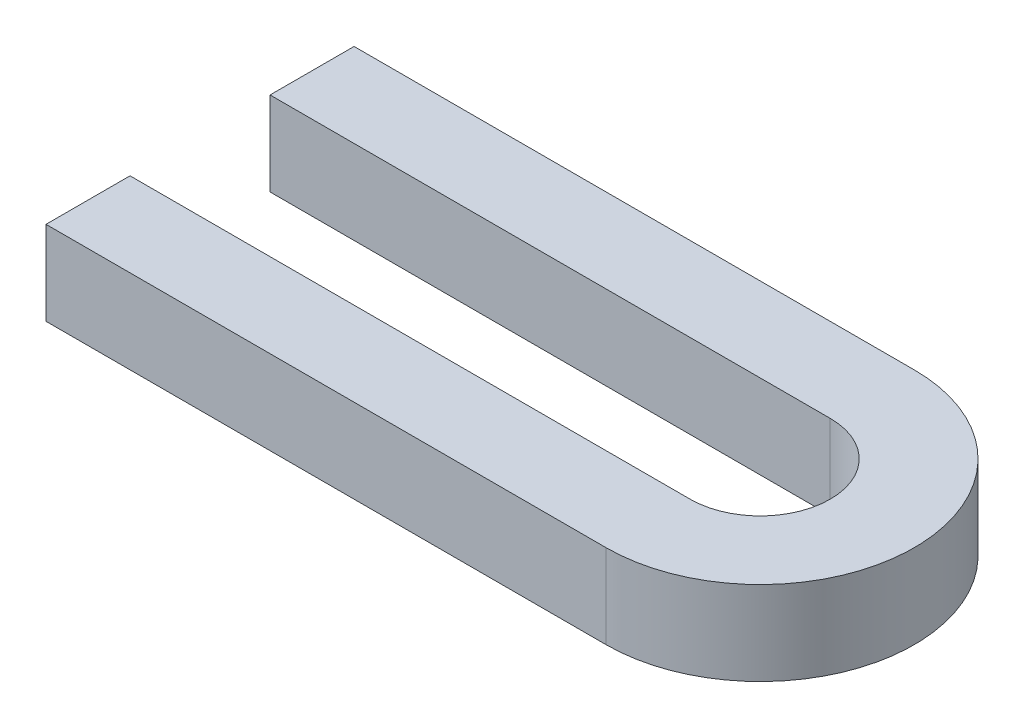
ISO-10303-21;
HEADER;
FILE_DESCRIPTION(('STEP AP214'),'2;1');
FILE_NAME('part.step','',(''),(''),'','','');
FILE_SCHEMA(('AUTOMOTIVE_DESIGN { 1 0 10303 214 1 1 1 1 }'));
ENDSEC;
DATA;
#1=APPLICATION_CONTEXT('core data for automotive mechanical design processes');
#2=APPLICATION_PROTOCOL_DEFINITION('international standard','automotive_design',2000,#1);
#3=PRODUCT_CONTEXT('',#1,'mechanical');
#4=PRODUCT('Part','Part','',(#3));
#5=PRODUCT_RELATED_PRODUCT_CATEGORY('part','',(#4));
#6=PRODUCT_DEFINITION_FORMATION('','',#4);
#7=PRODUCT_DEFINITION_CONTEXT('part definition',#1,'design');
#8=PRODUCT_DEFINITION('design','',#6,#7);
#9=PRODUCT_DEFINITION_SHAPE('','',#8);
#10=(LENGTH_UNIT() NAMED_UNIT(*) SI_UNIT(.MILLI.,.METRE.));
#11=(NAMED_UNIT(*) PLANE_ANGLE_UNIT() SI_UNIT($,.RADIAN.));
#12=(NAMED_UNIT(*) SI_UNIT($,.STERADIAN.) SOLID_ANGLE_UNIT());
#13=UNCERTAINTY_MEASURE_WITH_UNIT(LENGTH_MEASURE(1.E-05),#10,'distance_accuracy_value','');
#14=(GEOMETRIC_REPRESENTATION_CONTEXT(3) GLOBAL_UNCERTAINTY_ASSIGNED_CONTEXT((#13)) GLOBAL_UNIT_ASSIGNED_CONTEXT((#10,
#11,#12)) REPRESENTATION_CONTEXT('',''));
#15=CARTESIAN_POINT('',(0.,0.,0.));
#16=DIRECTION('',(0.,0.,1.));
#17=DIRECTION('',(1.,0.,0.));
#18=AXIS2_PLACEMENT_3D('',#15,#16,#17);
#19=CARTESIAN_POINT('',(0.,3.,0.));
#20=DIRECTION('',(0.,-1.,0.));
#21=DIRECTION('',(0.,0.,-1.));
#22=AXIS2_PLACEMENT_3D('',#19,#20,#21);
#23=CYLINDRICAL_SURFACE('',#22,2.5);
#24=CARTESIAN_POINT('',(0.,0.,0.));
#25=DIRECTION('',(0.,-1.,0.));
#26=DIRECTION('',(0.,0.,-1.));
#27=AXIS2_PLACEMENT_3D('',#24,#25,#26);
#28=CIRCLE('',#27,2.5);
#29=CARTESIAN_POINT('',(0.,0.,-2.5));
#30=VERTEX_POINT('',#29);
#31=CARTESIAN_POINT('',(0.,0.,2.5));
#32=VERTEX_POINT('',#31);
#33=EDGE_CURVE('E144',#30,#32,#28,.T.);
#34=ORIENTED_EDGE('',*,*,#33,.T.);
#35=DIRECTION('',(0.,-1.,0.));
#36=VECTOR('',#35,1.);
#37=CARTESIAN_POINT('',(0.,3.,2.5));
#38=LINE('',#37,#36);
#39=CARTESIAN_POINT('',(0.,3.,2.5));
#40=VERTEX_POINT('',#39);
#41=EDGE_CURVE('E11',#40,#32,#38,.T.);
#42=ORIENTED_EDGE('',*,*,#41,.F.);
#43=CARTESIAN_POINT('',(0.,3.,0.));
#44=DIRECTION('',(0.,-1.,0.));
#45=DIRECTION('',(0.,0.,-1.));
#46=AXIS2_PLACEMENT_3D('',#43,#44,#45);
#47=CIRCLE('',#46,2.5);
#48=CARTESIAN_POINT('',(0.,3.,-2.5));
#49=VERTEX_POINT('',#48);
#50=EDGE_CURVE('E166',#49,#40,#47,.T.);
#51=ORIENTED_EDGE('',*,*,#50,.F.);
#52=DIRECTION('',(0.,-1.,0.));
#53=VECTOR('',#52,1.);
#54=CARTESIAN_POINT('',(0.,3.,-2.5));
#55=LINE('',#54,#53);
#56=EDGE_CURVE('E140',#49,#30,#55,.T.);
#57=ORIENTED_EDGE('',*,*,#56,.T.);
#58=EDGE_LOOP('',(#34,#42,#51,#57));
#59=FACE_BOUND('',#58,.T.);
#60=ADVANCED_FACE('F43',(#59),#23,.F.);
#61=CARTESIAN_POINT('',(0.,3.,2.5));
#62=DIRECTION('',(0.,0.,1.));
#63=DIRECTION('',(1.,0.,0.));
#64=AXIS2_PLACEMENT_3D('',#61,#62,#63);
#65=PLANE('',#64);
#66=DIRECTION('',(-1.,0.,0.));
#67=VECTOR('',#66,1.);
#68=CARTESIAN_POINT('',(0.,0.,2.5));
#69=LINE('',#68,#67);
#70=CARTESIAN_POINT('',(-20.,0.,2.5));
#71=VERTEX_POINT('',#70);
#72=EDGE_CURVE('E148',#32,#71,#69,.T.);
#73=ORIENTED_EDGE('',*,*,#72,.T.);
#74=DIRECTION('',(0.,-1.,0.));
#75=VECTOR('',#74,1.);
#76=CARTESIAN_POINT('',(-20.,3.,2.5));
#77=LINE('',#76,#75);
#78=CARTESIAN_POINT('',(-20.,3.,2.5));
#79=VERTEX_POINT('',#78);
#80=EDGE_CURVE('E52',#79,#71,#77,.T.);
#81=ORIENTED_EDGE('',*,*,#80,.F.);
#82=DIRECTION('',(-1.,0.,0.));
#83=VECTOR('',#82,1.);
#84=CARTESIAN_POINT('',(0.,3.,2.5));
#85=LINE('',#84,#83);
#86=EDGE_CURVE('E103',#40,#79,#85,.T.);
#87=ORIENTED_EDGE('',*,*,#86,.F.);
#88=ORIENTED_EDGE('',*,*,#41,.T.);
#89=EDGE_LOOP('',(#73,#81,#87,#88));
#90=FACE_BOUND('',#89,.T.);
#91=ADVANCED_FACE('F212',(#90),#65,.F.);
#92=CARTESIAN_POINT('',(-20.,3.,2.5));
#93=DIRECTION('',(1.,0.,0.));
#94=DIRECTION('',(0.,0.,-1.));
#95=AXIS2_PLACEMENT_3D('',#92,#93,#94);
#96=PLANE('',#95);
#97=DIRECTION('',(0.,0.,1.));
#98=VECTOR('',#97,1.);
#99=CARTESIAN_POINT('',(-20.,0.,2.5));
#100=LINE('',#99,#98);
#101=CARTESIAN_POINT('',(-20.,0.,5.5));
#102=VERTEX_POINT('',#101);
#103=EDGE_CURVE('E151',#71,#102,#100,.T.);
#104=ORIENTED_EDGE('',*,*,#103,.T.);
#105=DIRECTION('',(0.,-1.,0.));
#106=VECTOR('',#105,1.);
#107=CARTESIAN_POINT('',(-20.,3.,5.5));
#108=LINE('',#107,#106);
#109=CARTESIAN_POINT('',(-20.,3.,5.5));
#110=VERTEX_POINT('',#109);
#111=EDGE_CURVE('E177',#110,#102,#108,.T.);
#112=ORIENTED_EDGE('',*,*,#111,.F.);
#113=DIRECTION('',(0.,0.,1.));
#114=VECTOR('',#113,1.);
#115=CARTESIAN_POINT('',(-20.,3.,2.5));
#116=LINE('',#115,#114);
#117=EDGE_CURVE('E187',#79,#110,#116,.T.);
#118=ORIENTED_EDGE('',*,*,#117,.F.);
#119=ORIENTED_EDGE('',*,*,#80,.T.);
#120=EDGE_LOOP('',(#104,#112,#118,#119));
#121=FACE_BOUND('',#120,.T.);
#122=ADVANCED_FACE('F185',(#121),#96,.F.);
#123=CARTESIAN_POINT('',(0.,3.,5.5));
#124=DIRECTION('',(0.,0.,-1.));
#125=DIRECTION('',(-1.,0.,0.));
#126=AXIS2_PLACEMENT_3D('',#123,#124,#125);
#127=PLANE('',#126);
#128=DIRECTION('',(1.,0.,0.));
#129=VECTOR('',#128,1.);
#130=CARTESIAN_POINT('',(0.,0.,5.5));
#131=LINE('',#130,#129);
#132=CARTESIAN_POINT('',(0.,0.,5.5));
#133=VERTEX_POINT('',#132);
#134=EDGE_CURVE('E154',#102,#133,#131,.T.);
#135=ORIENTED_EDGE('',*,*,#134,.T.);
#136=DIRECTION('',(0.,-1.,0.));
#137=VECTOR('',#136,1.);
#138=CARTESIAN_POINT('',(0.,3.,5.5));
#139=LINE('',#138,#137);
#140=CARTESIAN_POINT('',(0.,3.,5.5));
#141=VERTEX_POINT('',#140);
#142=EDGE_CURVE('E173',#141,#133,#139,.T.);
#143=ORIENTED_EDGE('',*,*,#142,.F.);
#144=DIRECTION('',(1.,0.,0.));
#145=VECTOR('',#144,1.);
#146=CARTESIAN_POINT('',(0.,3.,5.5));
#147=LINE('',#146,#145);
#148=EDGE_CURVE('E200',#110,#141,#147,.T.);
#149=ORIENTED_EDGE('',*,*,#148,.F.);
#150=ORIENTED_EDGE('',*,*,#111,.T.);
#151=EDGE_LOOP('',(#135,#143,#149,#150));
#152=FACE_BOUND('',#151,.T.);
#153=ADVANCED_FACE('F195',(#152),#127,.F.);
#154=CARTESIAN_POINT('',(0.,3.,0.));
#155=DIRECTION('',(0.,-1.,0.));
#156=DIRECTION('',(0.,0.,-1.));
#157=AXIS2_PLACEMENT_3D('',#154,#155,#156);
#158=CYLINDRICAL_SURFACE('',#157,5.5);
#159=CARTESIAN_POINT('',(0.,0.,0.));
#160=DIRECTION('',(0.,1.,0.));
#161=DIRECTION('',(0.,0.,-1.));
#162=AXIS2_PLACEMENT_3D('',#159,#160,#161);
#163=CIRCLE('',#162,5.5);
#164=CARTESIAN_POINT('',(0.,0.,-5.5));
#165=VERTEX_POINT('',#164);
#166=EDGE_CURVE('E157',#133,#165,#163,.T.);
#167=ORIENTED_EDGE('',*,*,#166,.T.);
#168=DIRECTION('',(0.,-1.,0.));
#169=VECTOR('',#168,1.);
#170=CARTESIAN_POINT('',(0.,3.,-5.5));
#171=LINE('',#170,#169);
#172=CARTESIAN_POINT('',(0.,3.,-5.5));
#173=VERTEX_POINT('',#172);
#174=EDGE_CURVE('E133',#173,#165,#171,.T.);
#175=ORIENTED_EDGE('',*,*,#174,.F.);
#176=CARTESIAN_POINT('',(0.,3.,0.));
#177=DIRECTION('',(0.,1.,0.));
#178=DIRECTION('',(0.,0.,-1.));
#179=AXIS2_PLACEMENT_3D('',#176,#177,#178);
#180=CIRCLE('',#179,5.5);
#181=EDGE_CURVE('E122',#141,#173,#180,.T.);
#182=ORIENTED_EDGE('',*,*,#181,.F.);
#183=ORIENTED_EDGE('',*,*,#142,.T.);
#184=EDGE_LOOP('',(#167,#175,#182,#183));
#185=FACE_BOUND('',#184,.T.);
#186=ADVANCED_FACE('F198',(#185),#158,.T.);
#187=CARTESIAN_POINT('',(0.,3.,-5.5));
#188=DIRECTION('',(0.,0.,1.));
#189=DIRECTION('',(1.,0.,0.));
#190=AXIS2_PLACEMENT_3D('',#187,#188,#189);
#191=PLANE('',#190);
#192=DIRECTION('',(-1.,0.,0.));
#193=VECTOR('',#192,1.);
#194=CARTESIAN_POINT('',(0.,0.,-5.5));
#195=LINE('',#194,#193);
#196=CARTESIAN_POINT('',(-20.,0.,-5.5));
#197=VERTEX_POINT('',#196);
#198=EDGE_CURVE('E131',#165,#197,#195,.T.);
#199=ORIENTED_EDGE('',*,*,#198,.T.);
#200=DIRECTION('',(0.,-1.,0.));
#201=VECTOR('',#200,1.);
#202=CARTESIAN_POINT('',(-20.,3.,-5.5));
#203=LINE('',#202,#201);
#204=CARTESIAN_POINT('',(-20.,3.,-5.5));
#205=VERTEX_POINT('',#204);
#206=EDGE_CURVE('E128',#205,#197,#203,.T.);
#207=ORIENTED_EDGE('',*,*,#206,.F.);
#208=DIRECTION('',(-1.,0.,0.));
#209=VECTOR('',#208,1.);
#210=CARTESIAN_POINT('',(0.,3.,-5.5));
#211=LINE('',#210,#209);
#212=EDGE_CURVE('E116',#173,#205,#211,.T.);
#213=ORIENTED_EDGE('',*,*,#212,.F.);
#214=ORIENTED_EDGE('',*,*,#174,.T.);
#215=EDGE_LOOP('',(#199,#207,#213,#214));
#216=FACE_BOUND('',#215,.T.);
#217=ADVANCED_FACE('F129',(#216),#191,.F.);
#218=CARTESIAN_POINT('',(-20.,3.,-5.5));
#219=DIRECTION('',(1.,0.,0.));
#220=DIRECTION('',(0.,0.,-1.));
#221=AXIS2_PLACEMENT_3D('',#218,#219,#220);
#222=PLANE('',#221);
#223=DIRECTION('',(0.,0.,1.));
#224=VECTOR('',#223,1.);
#225=CARTESIAN_POINT('',(-20.,0.,-5.5));
#226=LINE('',#225,#224);
#227=CARTESIAN_POINT('',(-20.,0.,-2.5));
#228=VERTEX_POINT('',#227);
#229=EDGE_CURVE('E89',#197,#228,#226,.T.);
#230=ORIENTED_EDGE('',*,*,#229,.T.);
#231=DIRECTION('',(0.,-1.,0.));
#232=VECTOR('',#231,1.);
#233=CARTESIAN_POINT('',(-20.,3.,-2.5));
#234=LINE('',#233,#232);
#235=CARTESIAN_POINT('',(-20.,3.,-2.5));
#236=VERTEX_POINT('',#235);
#237=EDGE_CURVE('E134',#236,#228,#234,.T.);
#238=ORIENTED_EDGE('',*,*,#237,.F.);
#239=DIRECTION('',(0.,0.,1.));
#240=VECTOR('',#239,1.);
#241=CARTESIAN_POINT('',(-20.,3.,-5.5));
#242=LINE('',#241,#240);
#243=EDGE_CURVE('E120',#205,#236,#242,.T.);
#244=ORIENTED_EDGE('',*,*,#243,.F.);
#245=ORIENTED_EDGE('',*,*,#206,.T.);
#246=EDGE_LOOP('',(#230,#238,#244,#245));
#247=FACE_BOUND('',#246,.T.);
#248=ADVANCED_FACE('F136',(#247),#222,.F.);
#249=CARTESIAN_POINT('',(0.,3.,-2.5));
#250=DIRECTION('',(0.,0.,-1.));
#251=DIRECTION('',(-1.,0.,0.));
#252=AXIS2_PLACEMENT_3D('',#249,#250,#251);
#253=PLANE('',#252);
#254=DIRECTION('',(1.,0.,0.));
#255=VECTOR('',#254,1.);
#256=CARTESIAN_POINT('',(0.,0.,-2.5));
#257=LINE('',#256,#255);
#258=EDGE_CURVE('E95',#228,#30,#257,.T.);
#259=ORIENTED_EDGE('',*,*,#258,.T.);
#260=ORIENTED_EDGE('',*,*,#56,.F.);
#261=DIRECTION('',(1.,0.,0.));
#262=VECTOR('',#261,1.);
#263=CARTESIAN_POINT('',(0.,3.,-2.5));
#264=LINE('',#263,#262);
#265=EDGE_CURVE('E60',#236,#49,#264,.T.);
#266=ORIENTED_EDGE('',*,*,#265,.F.);
#267=ORIENTED_EDGE('',*,*,#237,.T.);
#268=EDGE_LOOP('',(#259,#260,#266,#267));
#269=FACE_BOUND('',#268,.T.);
#270=ADVANCED_FACE('F228',(#269),#253,.F.);
#271=CARTESIAN_POINT('',(0.,3.,0.));
#272=DIRECTION('',(0.,-1.,0.));
#273=DIRECTION('',(0.,0.,-1.));
#274=AXIS2_PLACEMENT_3D('',#271,#272,#273);
#275=PLANE('',#274);
#276=ORIENTED_EDGE('',*,*,#50,.T.);
#277=ORIENTED_EDGE('',*,*,#86,.T.);
#278=ORIENTED_EDGE('',*,*,#117,.T.);
#279=ORIENTED_EDGE('',*,*,#148,.T.);
#280=ORIENTED_EDGE('',*,*,#181,.T.);
#281=ORIENTED_EDGE('',*,*,#212,.T.);
#282=ORIENTED_EDGE('',*,*,#243,.T.);
#283=ORIENTED_EDGE('',*,*,#265,.T.);
#284=EDGE_LOOP('',(#276,#277,#278,#279,#280,#281,#282,#283));
#285=FACE_BOUND('',#284,.T.);
#286=ADVANCED_FACE('F118',(#285),#275,.F.);
#287=CARTESIAN_POINT('',(0.,0.,0.));
#288=DIRECTION('',(0.,-1.,0.));
#289=DIRECTION('',(0.,0.,-1.));
#290=AXIS2_PLACEMENT_3D('',#287,#288,#289);
#291=PLANE('',#290);
#292=ORIENTED_EDGE('',*,*,#33,.F.);
#293=ORIENTED_EDGE('',*,*,#258,.F.);
#294=ORIENTED_EDGE('',*,*,#229,.F.);
#295=ORIENTED_EDGE('',*,*,#198,.F.);
#296=ORIENTED_EDGE('',*,*,#166,.F.);
#297=ORIENTED_EDGE('',*,*,#134,.F.);
#298=ORIENTED_EDGE('',*,*,#103,.F.);
#299=ORIENTED_EDGE('',*,*,#72,.F.);
#300=EDGE_LOOP('',(#292,#293,#294,#295,#296,#297,#298,#299));
#301=FACE_BOUND('',#300,.T.);
#302=ADVANCED_FACE('F191',(#301),#291,.T.);
#303=CLOSED_SHELL('',(#60,#91,#122,#153,#186,#217,#248,#270,#286,#302));
#304=MANIFOLD_SOLID_BREP('B2',#303);
#305=ADVANCED_BREP_SHAPE_REPRESENTATION('',(#18,#304),#14);
#306=SHAPE_DEFINITION_REPRESENTATION(#9,#305);
ENDSEC;
END-ISO-10303-21;
